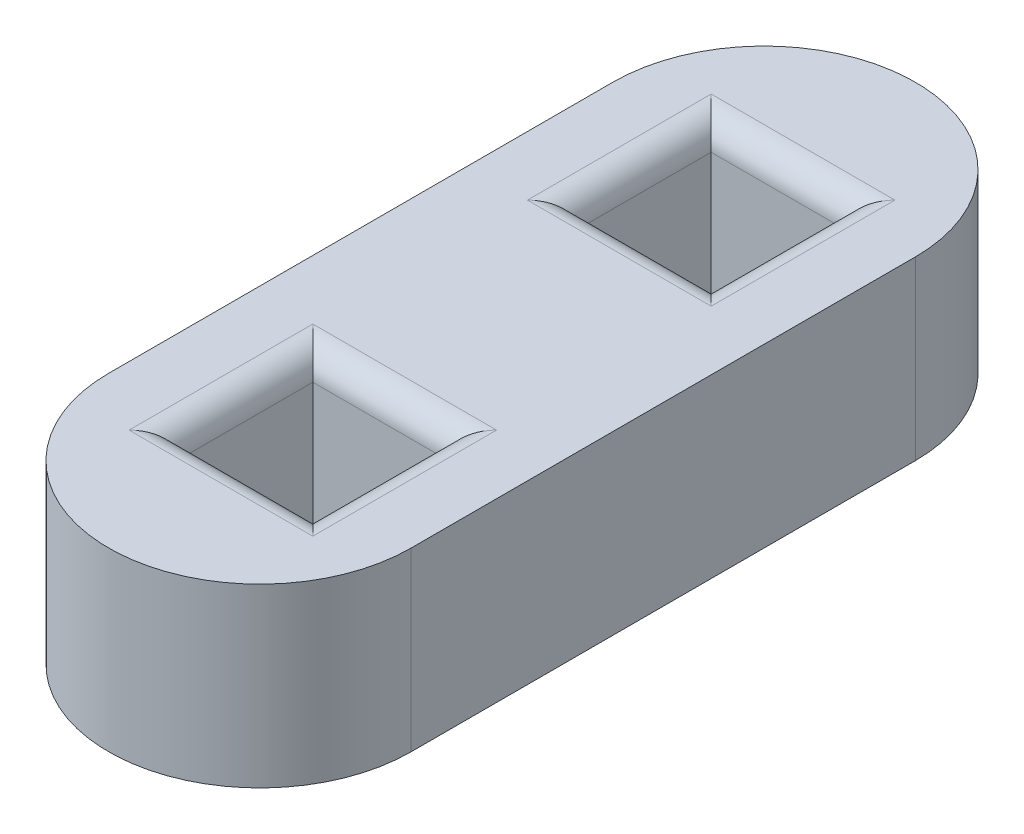
ISO-10303-21;
HEADER;
FILE_DESCRIPTION(('STEP AP214'),'2;1');
FILE_NAME('part.step','',(''),(''),'','','');
FILE_SCHEMA(('AUTOMOTIVE_DESIGN { 1 0 10303 214 1 1 1 1 }'));
ENDSEC;
DATA;
#1=APPLICATION_CONTEXT('core data for automotive mechanical design processes');
#2=APPLICATION_PROTOCOL_DEFINITION('international standard','automotive_design',2000,#1);
#3=PRODUCT_CONTEXT('',#1,'mechanical');
#4=PRODUCT('Part','Part','',(#3));
#5=PRODUCT_RELATED_PRODUCT_CATEGORY('part','',(#4));
#6=PRODUCT_DEFINITION_FORMATION('','',#4);
#7=PRODUCT_DEFINITION_CONTEXT('part definition',#1,'design');
#8=PRODUCT_DEFINITION('design','',#6,#7);
#9=PRODUCT_DEFINITION_SHAPE('','',#8);
#10=(LENGTH_UNIT() NAMED_UNIT(*) SI_UNIT(.MILLI.,.METRE.));
#11=(NAMED_UNIT(*) PLANE_ANGLE_UNIT() SI_UNIT($,.RADIAN.));
#12=(NAMED_UNIT(*) SI_UNIT($,.STERADIAN.) SOLID_ANGLE_UNIT());
#13=UNCERTAINTY_MEASURE_WITH_UNIT(LENGTH_MEASURE(1.E-05),#10,'distance_accuracy_value','');
#14=(GEOMETRIC_REPRESENTATION_CONTEXT(3) GLOBAL_UNCERTAINTY_ASSIGNED_CONTEXT((#13)) GLOBAL_UNIT_ASSIGNED_CONTEXT((#10,
#11,#12)) REPRESENTATION_CONTEXT('',''));
#15=CARTESIAN_POINT('',(0.,0.,0.));
#16=DIRECTION('',(0.,0.,1.));
#17=DIRECTION('',(1.,0.,0.));
#18=AXIS2_PLACEMENT_3D('',#15,#16,#17);
#19=CARTESIAN_POINT('',(0.,7.,0.));
#20=DIRECTION('',(0.,1.,0.));
#21=DIRECTION('',(0.,0.,1.));
#22=AXIS2_PLACEMENT_3D('',#19,#20,#21);
#23=PLANE('',#22);
#24=DIRECTION('',(1.,0.,0.));
#25=VECTOR('',#24,1.);
#26=CARTESIAN_POINT('',(0.,7.,21.544));
#27=LINE('',#26,#25);
#28=CARTESIAN_POINT('',(3.644,7.,21.544));
#29=VERTEX_POINT('',#28);
#30=CARTESIAN_POINT('',(-3.644,7.,21.544));
#31=VERTEX_POINT('',#30);
#32=EDGE_CURVE('E225',#29,#31,#27,.F.);
#33=ORIENTED_EDGE('',*,*,#32,.T.);
#34=DIRECTION('',(0.,0.,1.));
#35=VECTOR('',#34,1.);
#36=CARTESIAN_POINT('',(-3.644,7.,0.));
#37=LINE('',#36,#35);
#38=CARTESIAN_POINT('',(-3.644,7.,14.256));
#39=VERTEX_POINT('',#38);
#40=EDGE_CURVE('E227',#31,#39,#37,.F.);
#41=ORIENTED_EDGE('',*,*,#40,.T.);
#42=DIRECTION('',(-1.,0.,0.));
#43=VECTOR('',#42,1.);
#44=CARTESIAN_POINT('',(0.,7.,14.256));
#45=LINE('',#44,#43);
#46=CARTESIAN_POINT('',(3.644,7.,14.256));
#47=VERTEX_POINT('',#46);
#48=EDGE_CURVE('E221',#39,#47,#45,.F.);
#49=ORIENTED_EDGE('',*,*,#48,.T.);
#50=DIRECTION('',(0.,0.,-1.));
#51=VECTOR('',#50,1.);
#52=CARTESIAN_POINT('',(3.644,7.,0.));
#53=LINE('',#52,#51);
#54=EDGE_CURVE('E223',#47,#29,#53,.F.);
#55=ORIENTED_EDGE('',*,*,#54,.T.);
#56=EDGE_LOOP('',(#33,#41,#49,#55));
#57=FACE_BOUND('',#56,.T.);
#58=DIRECTION('',(0.,0.,-1.));
#59=VECTOR('',#58,1.);
#60=CARTESIAN_POINT('',(3.644,7.,0.));
#61=LINE('',#60,#59);
#62=CARTESIAN_POINT('',(3.644,7.,-1.544));
#63=VERTEX_POINT('',#62);
#64=CARTESIAN_POINT('',(3.644,7.,5.744));
#65=VERTEX_POINT('',#64);
#66=EDGE_CURVE('E216',#63,#65,#61,.F.);
#67=ORIENTED_EDGE('',*,*,#66,.T.);
#68=DIRECTION('',(1.,0.,0.));
#69=VECTOR('',#68,1.);
#70=CARTESIAN_POINT('',(0.,7.,5.744));
#71=LINE('',#70,#69);
#72=CARTESIAN_POINT('',(-3.644,7.,5.744));
#73=VERTEX_POINT('',#72);
#74=EDGE_CURVE('E218',#65,#73,#71,.F.);
#75=ORIENTED_EDGE('',*,*,#74,.T.);
#76=DIRECTION('',(0.,0.,1.));
#77=VECTOR('',#76,1.);
#78=CARTESIAN_POINT('',(-3.644,7.,0.));
#79=LINE('',#78,#77);
#80=CARTESIAN_POINT('',(-3.644,7.,-1.544));
#81=VERTEX_POINT('',#80);
#82=EDGE_CURVE('E214',#73,#81,#79,.F.);
#83=ORIENTED_EDGE('',*,*,#82,.T.);
#84=DIRECTION('',(-1.,0.,0.));
#85=VECTOR('',#84,1.);
#86=CARTESIAN_POINT('',(0.,7.,-1.544));
#87=LINE('',#86,#85);
#88=EDGE_CURVE('E212',#81,#63,#87,.F.);
#89=ORIENTED_EDGE('',*,*,#88,.T.);
#90=EDGE_LOOP('',(#67,#75,#83,#89));
#91=FACE_BOUND('',#90,.T.);
#92=CARTESIAN_POINT('',(0.,7.,0.));
#93=DIRECTION('',(0.,1.,0.));
#94=DIRECTION('',(0.,0.,1.));
#95=AXIS2_PLACEMENT_3D('',#92,#93,#94);
#96=CIRCLE('',#95,6.);
#97=CARTESIAN_POINT('',(6.,7.,0.));
#98=VERTEX_POINT('',#97);
#99=CARTESIAN_POINT('',(-6.,7.,0.));
#100=VERTEX_POINT('',#99);
#101=EDGE_CURVE('E189',#98,#100,#96,.T.);
#102=ORIENTED_EDGE('',*,*,#101,.T.);
#103=DIRECTION('',(0.,0.,1.));
#104=VECTOR('',#103,1.);
#105=CARTESIAN_POINT('',(-6.,7.,0.));
#106=LINE('',#105,#104);
#107=CARTESIAN_POINT('',(-6.,7.,20.));
#108=VERTEX_POINT('',#107);
#109=EDGE_CURVE('E178',#100,#108,#106,.T.);
#110=ORIENTED_EDGE('',*,*,#109,.T.);
#111=CARTESIAN_POINT('',(0.,7.,20.));
#112=DIRECTION('',(0.,1.,0.));
#113=DIRECTION('',(0.,0.,1.));
#114=AXIS2_PLACEMENT_3D('',#111,#112,#113);
#115=CIRCLE('',#114,6.);
#116=CARTESIAN_POINT('',(6.,7.,20.));
#117=VERTEX_POINT('',#116);
#118=EDGE_CURVE('E188',#108,#117,#115,.T.);
#119=ORIENTED_EDGE('',*,*,#118,.T.);
#120=DIRECTION('',(0.,0.,-1.));
#121=VECTOR('',#120,1.);
#122=CARTESIAN_POINT('',(6.,7.,0.));
#123=LINE('',#122,#121);
#124=EDGE_CURVE('E193',#117,#98,#123,.T.);
#125=ORIENTED_EDGE('',*,*,#124,.T.);
#126=EDGE_LOOP('',(#102,#110,#119,#125));
#127=FACE_BOUND('',#126,.T.);
#128=ADVANCED_FACE('F39',(#57,#91,#127),#23,.T.);
#129=CARTESIAN_POINT('',(0.,0.,0.));
#130=DIRECTION('',(0.,1.,0.));
#131=DIRECTION('',(0.,0.,1.));
#132=AXIS2_PLACEMENT_3D('',#129,#130,#131);
#133=PLANE('',#132);
#134=DIRECTION('',(1.,0.,0.));
#135=VECTOR('',#134,1.);
#136=CARTESIAN_POINT('',(2.644,0.,21.544));
#137=LINE('',#136,#135);
#138=CARTESIAN_POINT('',(-3.644,0.,21.544));
#139=VERTEX_POINT('',#138);
#140=CARTESIAN_POINT('',(3.644,0.,21.544));
#141=VERTEX_POINT('',#140);
#142=EDGE_CURVE('E256',#139,#141,#137,.T.);
#143=ORIENTED_EDGE('',*,*,#142,.T.);
#144=DIRECTION('',(0.,0.,-1.));
#145=VECTOR('',#144,1.);
#146=CARTESIAN_POINT('',(3.644,0.,15.256));
#147=LINE('',#146,#145);
#148=CARTESIAN_POINT('',(3.644,0.,14.256));
#149=VERTEX_POINT('',#148);
#150=EDGE_CURVE('E258',#141,#149,#147,.T.);
#151=ORIENTED_EDGE('',*,*,#150,.T.);
#152=DIRECTION('',(-1.,0.,0.));
#153=VECTOR('',#152,1.);
#154=CARTESIAN_POINT('',(-2.644,0.,14.256));
#155=LINE('',#154,#153);
#156=CARTESIAN_POINT('',(-3.644,0.,14.256));
#157=VERTEX_POINT('',#156);
#158=EDGE_CURVE('E252',#149,#157,#155,.T.);
#159=ORIENTED_EDGE('',*,*,#158,.T.);
#160=DIRECTION('',(0.,0.,1.));
#161=VECTOR('',#160,1.);
#162=CARTESIAN_POINT('',(-3.644,0.,20.544));
#163=LINE('',#162,#161);
#164=EDGE_CURVE('E254',#157,#139,#163,.T.);
#165=ORIENTED_EDGE('',*,*,#164,.T.);
#166=EDGE_LOOP('',(#143,#151,#159,#165));
#167=FACE_BOUND('',#166,.T.);
#168=DIRECTION('',(0.,0.,1.));
#169=VECTOR('',#168,1.);
#170=CARTESIAN_POINT('',(-3.644,0.,4.744));
#171=LINE('',#170,#169);
#172=CARTESIAN_POINT('',(-3.644,0.,-1.544));
#173=VERTEX_POINT('',#172);
#174=CARTESIAN_POINT('',(-3.644,0.,5.744));
#175=VERTEX_POINT('',#174);
#176=EDGE_CURVE('E243',#173,#175,#171,.T.);
#177=ORIENTED_EDGE('',*,*,#176,.T.);
#178=DIRECTION('',(1.,0.,0.));
#179=VECTOR('',#178,1.);
#180=CARTESIAN_POINT('',(2.644,0.,5.744));
#181=LINE('',#180,#179);
#182=CARTESIAN_POINT('',(3.644,0.,5.744));
#183=VERTEX_POINT('',#182);
#184=EDGE_CURVE('E249',#175,#183,#181,.T.);
#185=ORIENTED_EDGE('',*,*,#184,.T.);
#186=DIRECTION('',(0.,0.,-1.));
#187=VECTOR('',#186,1.);
#188=CARTESIAN_POINT('',(3.644,0.,-0.544000000000001));
#189=LINE('',#188,#187);
#190=CARTESIAN_POINT('',(3.644,0.,-1.544));
#191=VERTEX_POINT('',#190);
#192=EDGE_CURVE('E247',#183,#191,#189,.T.);
#193=ORIENTED_EDGE('',*,*,#192,.T.);
#194=DIRECTION('',(-1.,0.,0.));
#195=VECTOR('',#194,1.);
#196=CARTESIAN_POINT('',(-2.644,0.,-1.544));
#197=LINE('',#196,#195);
#198=EDGE_CURVE('E245',#191,#173,#197,.T.);
#199=ORIENTED_EDGE('',*,*,#198,.T.);
#200=EDGE_LOOP('',(#177,#185,#193,#199));
#201=FACE_BOUND('',#200,.T.);
#202=CARTESIAN_POINT('',(0.,0.,0.));
#203=DIRECTION('',(0.,1.,0.));
#204=DIRECTION('',(0.,0.,1.));
#205=AXIS2_PLACEMENT_3D('',#202,#203,#204);
#206=CIRCLE('',#205,6.);
#207=CARTESIAN_POINT('',(6.,0.,0.));
#208=VERTEX_POINT('',#207);
#209=CARTESIAN_POINT('',(-6.,0.,0.));
#210=VERTEX_POINT('',#209);
#211=EDGE_CURVE('E201',#208,#210,#206,.T.);
#212=ORIENTED_EDGE('',*,*,#211,.F.);
#213=DIRECTION('',(0.,0.,-1.));
#214=VECTOR('',#213,1.);
#215=CARTESIAN_POINT('',(6.,0.,0.));
#216=LINE('',#215,#214);
#217=CARTESIAN_POINT('',(6.,0.,20.));
#218=VERTEX_POINT('',#217);
#219=EDGE_CURVE('E197',#218,#208,#216,.T.);
#220=ORIENTED_EDGE('',*,*,#219,.F.);
#221=CARTESIAN_POINT('',(0.,0.,20.));
#222=DIRECTION('',(0.,1.,0.));
#223=DIRECTION('',(0.,0.,1.));
#224=AXIS2_PLACEMENT_3D('',#221,#222,#223);
#225=CIRCLE('',#224,6.);
#226=CARTESIAN_POINT('',(-6.,0.,20.));
#227=VERTEX_POINT('',#226);
#228=EDGE_CURVE('E361',#227,#218,#225,.T.);
#229=ORIENTED_EDGE('',*,*,#228,.F.);
#230=DIRECTION('',(0.,0.,1.));
#231=VECTOR('',#230,1.);
#232=CARTESIAN_POINT('',(-6.,0.,0.));
#233=LINE('',#232,#231);
#234=EDGE_CURVE('E359',#210,#227,#233,.T.);
#235=ORIENTED_EDGE('',*,*,#234,.F.);
#236=EDGE_LOOP('',(#212,#220,#229,#235));
#237=FACE_BOUND('',#236,.T.);
#238=ADVANCED_FACE('F372',(#167,#201,#237),#133,.F.);
#239=CARTESIAN_POINT('',(0.,7.,0.));
#240=DIRECTION('',(0.,-1.,0.));
#241=DIRECTION('',(0.,0.,-1.));
#242=AXIS2_PLACEMENT_3D('',#239,#240,#241);
#243=CYLINDRICAL_SURFACE('',#242,6.);
#244=ORIENTED_EDGE('',*,*,#211,.T.);
#245=DIRECTION('',(0.,-1.,0.));
#246=VECTOR('',#245,1.);
#247=CARTESIAN_POINT('',(-6.,7.,0.));
#248=LINE('',#247,#246);
#249=EDGE_CURVE('E182',#100,#210,#248,.T.);
#250=ORIENTED_EDGE('',*,*,#249,.F.);
#251=ORIENTED_EDGE('',*,*,#101,.F.);
#252=DIRECTION('',(0.,-1.,0.));
#253=VECTOR('',#252,1.);
#254=CARTESIAN_POINT('',(6.,7.,0.));
#255=LINE('',#254,#253);
#256=EDGE_CURVE('E357',#98,#208,#255,.T.);
#257=ORIENTED_EDGE('',*,*,#256,.T.);
#258=EDGE_LOOP('',(#244,#250,#251,#257));
#259=FACE_BOUND('',#258,.T.);
#260=ADVANCED_FACE('F199',(#259),#243,.T.);
#261=CARTESIAN_POINT('',(-6.,7.,0.));
#262=DIRECTION('',(1.,0.,0.));
#263=DIRECTION('',(0.,0.,-1.));
#264=AXIS2_PLACEMENT_3D('',#261,#262,#263);
#265=PLANE('',#264);
#266=ORIENTED_EDGE('',*,*,#234,.T.);
#267=DIRECTION('',(0.,-1.,0.));
#268=VECTOR('',#267,1.);
#269=CARTESIAN_POINT('',(-6.,7.,20.));
#270=LINE('',#269,#268);
#271=EDGE_CURVE('E185',#108,#227,#270,.T.);
#272=ORIENTED_EDGE('',*,*,#271,.F.);
#273=ORIENTED_EDGE('',*,*,#109,.F.);
#274=ORIENTED_EDGE('',*,*,#249,.T.);
#275=EDGE_LOOP('',(#266,#272,#273,#274));
#276=FACE_BOUND('',#275,.T.);
#277=ADVANCED_FACE('F180',(#276),#265,.F.);
#278=CARTESIAN_POINT('',(0.,7.,20.));
#279=DIRECTION('',(0.,-1.,0.));
#280=DIRECTION('',(0.,0.,-1.));
#281=AXIS2_PLACEMENT_3D('',#278,#279,#280);
#282=CYLINDRICAL_SURFACE('',#281,6.);
#283=ORIENTED_EDGE('',*,*,#228,.T.);
#284=DIRECTION('',(0.,-1.,0.));
#285=VECTOR('',#284,1.);
#286=CARTESIAN_POINT('',(6.,7.,20.));
#287=LINE('',#286,#285);
#288=EDGE_CURVE('E206',#117,#218,#287,.T.);
#289=ORIENTED_EDGE('',*,*,#288,.F.);
#290=ORIENTED_EDGE('',*,*,#118,.F.);
#291=ORIENTED_EDGE('',*,*,#271,.T.);
#292=EDGE_LOOP('',(#283,#289,#290,#291));
#293=FACE_BOUND('',#292,.T.);
#294=ADVANCED_FACE('F373',(#293),#282,.T.);
#295=CARTESIAN_POINT('',(6.,7.,0.));
#296=DIRECTION('',(-1.,0.,0.));
#297=DIRECTION('',(0.,0.,1.));
#298=AXIS2_PLACEMENT_3D('',#295,#296,#297);
#299=PLANE('',#298);
#300=ORIENTED_EDGE('',*,*,#219,.T.);
#301=ORIENTED_EDGE('',*,*,#256,.F.);
#302=ORIENTED_EDGE('',*,*,#124,.F.);
#303=ORIENTED_EDGE('',*,*,#288,.T.);
#304=EDGE_LOOP('',(#300,#301,#302,#303));
#305=FACE_BOUND('',#304,.T.);
#306=ADVANCED_FACE('F368',(#305),#299,.F.);
#307=CARTESIAN_POINT('',(2.644,7.,4.744));
#308=DIRECTION('',(-1.,0.,0.));
#309=DIRECTION('',(0.,0.,1.));
#310=AXIS2_PLACEMENT_3D('',#307,#308,#309);
#311=PLANE('',#310);
#312=DIRECTION('',(0.,-1.,0.));
#313=VECTOR('',#312,1.);
#314=CARTESIAN_POINT('',(2.644,7.,-0.544000000000001));
#315=LINE('',#314,#313);
#316=CARTESIAN_POINT('',(2.644,6.,-0.544000000000001));
#317=VERTEX_POINT('',#316);
#318=CARTESIAN_POINT('',(2.644,1.,-0.544000000000001));
#319=VERTEX_POINT('',#318);
#320=EDGE_CURVE('E353',#317,#319,#315,.T.);
#321=ORIENTED_EDGE('',*,*,#320,.T.);
#322=DIRECTION('',(0.,0.,-1.));
#323=VECTOR('',#322,1.);
#324=CARTESIAN_POINT('',(2.644,1.,4.744));
#325=LINE('',#324,#323);
#326=CARTESIAN_POINT('',(2.644,1.,4.744));
#327=VERTEX_POINT('',#326);
#328=EDGE_CURVE('E269',#319,#327,#325,.F.);
#329=ORIENTED_EDGE('',*,*,#328,.T.);
#330=DIRECTION('',(0.,-1.,0.));
#331=VECTOR('',#330,1.);
#332=CARTESIAN_POINT('',(2.644,7.,4.744));
#333=LINE('',#332,#331);
#334=CARTESIAN_POINT('',(2.644,6.,4.744));
#335=VERTEX_POINT('',#334);
#336=EDGE_CURVE('E338',#335,#327,#333,.T.);
#337=ORIENTED_EDGE('',*,*,#336,.F.);
#338=DIRECTION('',(0.,0.,-1.));
#339=VECTOR('',#338,1.);
#340=CARTESIAN_POINT('',(2.644,6.,4.744));
#341=LINE('',#340,#339);
#342=EDGE_CURVE('E267',#335,#317,#341,.T.);
#343=ORIENTED_EDGE('',*,*,#342,.T.);
#344=EDGE_LOOP('',(#321,#329,#337,#343));
#345=FACE_BOUND('',#344,.T.);
#346=ADVANCED_FACE('F341',(#345),#311,.T.);
#347=CARTESIAN_POINT('',(-2.644,7.,-0.544000000000001));
#348=DIRECTION('',(0.,0.,1.));
#349=DIRECTION('',(1.,0.,0.));
#350=AXIS2_PLACEMENT_3D('',#347,#348,#349);
#351=PLANE('',#350);
#352=DIRECTION('',(0.,-1.,0.));
#353=VECTOR('',#352,1.);
#354=CARTESIAN_POINT('',(-2.644,7.,-0.544000000000001));
#355=LINE('',#354,#353);
#356=CARTESIAN_POINT('',(-2.644,6.,-0.544000000000001));
#357=VERTEX_POINT('',#356);
#358=CARTESIAN_POINT('',(-2.644,1.,-0.544000000000001));
#359=VERTEX_POINT('',#358);
#360=EDGE_CURVE('E345',#357,#359,#355,.T.);
#361=ORIENTED_EDGE('',*,*,#360,.T.);
#362=DIRECTION('',(-1.,0.,0.));
#363=VECTOR('',#362,1.);
#364=CARTESIAN_POINT('',(2.644,1.,-0.544000000000001));
#365=LINE('',#364,#363);
#366=EDGE_CURVE('E272',#359,#319,#365,.F.);
#367=ORIENTED_EDGE('',*,*,#366,.T.);
#368=ORIENTED_EDGE('',*,*,#320,.F.);
#369=DIRECTION('',(-1.,0.,0.));
#370=VECTOR('',#369,1.);
#371=CARTESIAN_POINT('',(-2.644,6.,-0.544000000000001));
#372=LINE('',#371,#370);
#373=EDGE_CURVE('E61',#317,#357,#372,.T.);
#374=ORIENTED_EDGE('',*,*,#373,.T.);
#375=EDGE_LOOP('',(#361,#367,#368,#374));
#376=FACE_BOUND('',#375,.T.);
#377=ADVANCED_FACE('F393',(#376),#351,.T.);
#378=CARTESIAN_POINT('',(-2.644,7.,4.744));
#379=DIRECTION('',(1.,0.,0.));
#380=DIRECTION('',(0.,0.,-1.));
#381=AXIS2_PLACEMENT_3D('',#378,#379,#380);
#382=PLANE('',#381);
#383=DIRECTION('',(0.,-1.,0.));
#384=VECTOR('',#383,1.);
#385=CARTESIAN_POINT('',(-2.644,7.,4.744));
#386=LINE('',#385,#384);
#387=CARTESIAN_POINT('',(-2.644,6.,4.744));
#388=VERTEX_POINT('',#387);
#389=CARTESIAN_POINT('',(-2.644,1.,4.744));
#390=VERTEX_POINT('',#389);
#391=EDGE_CURVE('E340',#388,#390,#386,.T.);
#392=ORIENTED_EDGE('',*,*,#391,.T.);
#393=DIRECTION('',(0.,0.,1.));
#394=VECTOR('',#393,1.);
#395=CARTESIAN_POINT('',(-2.644,1.,-0.544000000000001));
#396=LINE('',#395,#394);
#397=EDGE_CURVE('E11',#390,#359,#396,.F.);
#398=ORIENTED_EDGE('',*,*,#397,.T.);
#399=ORIENTED_EDGE('',*,*,#360,.F.);
#400=DIRECTION('',(0.,0.,1.));
#401=VECTOR('',#400,1.);
#402=CARTESIAN_POINT('',(-2.644,6.,4.744));
#403=LINE('',#402,#401);
#404=EDGE_CURVE('E48',#357,#388,#403,.T.);
#405=ORIENTED_EDGE('',*,*,#404,.T.);
#406=EDGE_LOOP('',(#392,#398,#399,#405));
#407=FACE_BOUND('',#406,.T.);
#408=ADVANCED_FACE('F396',(#407),#382,.T.);
#409=CARTESIAN_POINT('',(-2.644,7.,4.744));
#410=DIRECTION('',(0.,0.,-1.));
#411=DIRECTION('',(-1.,0.,0.));
#412=AXIS2_PLACEMENT_3D('',#409,#410,#411);
#413=PLANE('',#412);
#414=ORIENTED_EDGE('',*,*,#336,.T.);
#415=DIRECTION('',(1.,0.,0.));
#416=VECTOR('',#415,1.);
#417=CARTESIAN_POINT('',(-2.644,1.,4.744));
#418=LINE('',#417,#416);
#419=EDGE_CURVE('E264',#327,#390,#418,.F.);
#420=ORIENTED_EDGE('',*,*,#419,.T.);
#421=ORIENTED_EDGE('',*,*,#391,.F.);
#422=DIRECTION('',(1.,0.,0.));
#423=VECTOR('',#422,1.);
#424=CARTESIAN_POINT('',(-2.644,6.,4.744));
#425=LINE('',#424,#423);
#426=EDGE_CURVE('E261',#388,#335,#425,.T.);
#427=ORIENTED_EDGE('',*,*,#426,.T.);
#428=EDGE_LOOP('',(#414,#420,#421,#427));
#429=FACE_BOUND('',#428,.T.);
#430=ADVANCED_FACE('F337',(#429),#413,.T.);
#431=CARTESIAN_POINT('',(-2.644,7.,15.256));
#432=DIRECTION('',(1.,0.,0.));
#433=DIRECTION('',(0.,0.,-1.));
#434=AXIS2_PLACEMENT_3D('',#431,#432,#433);
#435=PLANE('',#434);
#436=DIRECTION('',(0.,-1.,0.));
#437=VECTOR('',#436,1.);
#438=CARTESIAN_POINT('',(-2.644,7.,15.256));
#439=LINE('',#438,#437);
#440=CARTESIAN_POINT('',(-2.644,6.,15.256));
#441=VERTEX_POINT('',#440);
#442=CARTESIAN_POINT('',(-2.644,1.,15.256));
#443=VERTEX_POINT('',#442);
#444=EDGE_CURVE('E286',#441,#443,#439,.T.);
#445=ORIENTED_EDGE('',*,*,#444,.F.);
#446=DIRECTION('',(0.,0.,1.));
#447=VECTOR('',#446,1.);
#448=CARTESIAN_POINT('',(-2.644,6.,15.256));
#449=LINE('',#448,#447);
#450=CARTESIAN_POINT('',(-2.644,6.,20.544));
#451=VERTEX_POINT('',#450);
#452=EDGE_CURVE('E204',#441,#451,#449,.T.);
#453=ORIENTED_EDGE('',*,*,#452,.T.);
#454=DIRECTION('',(0.,-1.,0.));
#455=VECTOR('',#454,1.);
#456=CARTESIAN_POINT('',(-2.644,7.,20.544));
#457=LINE('',#456,#455);
#458=CARTESIAN_POINT('',(-2.644,1.,20.544));
#459=VERTEX_POINT('',#458);
#460=EDGE_CURVE('E343',#451,#459,#457,.T.);
#461=ORIENTED_EDGE('',*,*,#460,.T.);
#462=DIRECTION('',(0.,0.,1.));
#463=VECTOR('',#462,1.);
#464=CARTESIAN_POINT('',(-2.644,1.,15.256));
#465=LINE('',#464,#463);
#466=EDGE_CURVE('E202',#459,#443,#465,.F.);
#467=ORIENTED_EDGE('',*,*,#466,.T.);
#468=EDGE_LOOP('',(#445,#453,#461,#467));
#469=FACE_BOUND('',#468,.T.);
#470=ADVANCED_FACE('F401',(#469),#435,.T.);
#471=CARTESIAN_POINT('',(-2.644,7.,20.544));
#472=DIRECTION('',(0.,0.,-1.));
#473=DIRECTION('',(-1.,0.,0.));
#474=AXIS2_PLACEMENT_3D('',#471,#472,#473);
#475=PLANE('',#474);
#476=ORIENTED_EDGE('',*,*,#460,.F.);
#477=DIRECTION('',(1.,0.,0.));
#478=VECTOR('',#477,1.);
#479=CARTESIAN_POINT('',(-2.644,6.,20.544));
#480=LINE('',#479,#478);
#481=CARTESIAN_POINT('',(2.644,6.,20.544));
#482=VERTEX_POINT('',#481);
#483=EDGE_CURVE('E232',#451,#482,#480,.T.);
#484=ORIENTED_EDGE('',*,*,#483,.T.);
#485=DIRECTION('',(0.,-1.,0.));
#486=VECTOR('',#485,1.);
#487=CARTESIAN_POINT('',(2.644,7.,20.544));
#488=LINE('',#487,#486);
#489=CARTESIAN_POINT('',(2.644,1.,20.544));
#490=VERTEX_POINT('',#489);
#491=EDGE_CURVE('E348',#482,#490,#488,.T.);
#492=ORIENTED_EDGE('',*,*,#491,.T.);
#493=DIRECTION('',(1.,0.,0.));
#494=VECTOR('',#493,1.);
#495=CARTESIAN_POINT('',(-2.644,1.,20.544));
#496=LINE('',#495,#494);
#497=EDGE_CURVE('E230',#490,#459,#496,.F.);
#498=ORIENTED_EDGE('',*,*,#497,.T.);
#499=EDGE_LOOP('',(#476,#484,#492,#498));
#500=FACE_BOUND('',#499,.T.);
#501=ADVANCED_FACE('F404',(#500),#475,.T.);
#502=CARTESIAN_POINT('',(2.644,7.,15.256));
#503=DIRECTION('',(-1.,0.,0.));
#504=DIRECTION('',(0.,0.,1.));
#505=AXIS2_PLACEMENT_3D('',#502,#503,#504);
#506=PLANE('',#505);
#507=ORIENTED_EDGE('',*,*,#491,.F.);
#508=DIRECTION('',(0.,0.,-1.));
#509=VECTOR('',#508,1.);
#510=CARTESIAN_POINT('',(2.644,6.,15.256));
#511=LINE('',#510,#509);
#512=CARTESIAN_POINT('',(2.644,6.,15.256));
#513=VERTEX_POINT('',#512);
#514=EDGE_CURVE('E237',#482,#513,#511,.T.);
#515=ORIENTED_EDGE('',*,*,#514,.T.);
#516=DIRECTION('',(0.,-1.,0.));
#517=VECTOR('',#516,1.);
#518=CARTESIAN_POINT('',(2.644,7.,15.256));
#519=LINE('',#518,#517);
#520=CARTESIAN_POINT('',(2.644,1.,15.256));
#521=VERTEX_POINT('',#520);
#522=EDGE_CURVE('E425',#513,#521,#519,.T.);
#523=ORIENTED_EDGE('',*,*,#522,.T.);
#524=DIRECTION('',(0.,0.,-1.));
#525=VECTOR('',#524,1.);
#526=CARTESIAN_POINT('',(2.644,1.,20.544));
#527=LINE('',#526,#525);
#528=EDGE_CURVE('E234',#521,#490,#527,.F.);
#529=ORIENTED_EDGE('',*,*,#528,.T.);
#530=EDGE_LOOP('',(#507,#515,#523,#529));
#531=FACE_BOUND('',#530,.T.);
#532=ADVANCED_FACE('F408',(#531),#506,.T.);
#533=CARTESIAN_POINT('',(-2.644,7.,15.256));
#534=DIRECTION('',(0.,0.,1.));
#535=DIRECTION('',(1.,0.,0.));
#536=AXIS2_PLACEMENT_3D('',#533,#534,#535);
#537=PLANE('',#536);
#538=ORIENTED_EDGE('',*,*,#522,.F.);
#539=DIRECTION('',(-1.,0.,0.));
#540=VECTOR('',#539,1.);
#541=CARTESIAN_POINT('',(-2.644,6.,15.256));
#542=LINE('',#541,#540);
#543=EDGE_CURVE('E241',#513,#441,#542,.T.);
#544=ORIENTED_EDGE('',*,*,#543,.T.);
#545=ORIENTED_EDGE('',*,*,#444,.T.);
#546=DIRECTION('',(-1.,0.,0.));
#547=VECTOR('',#546,1.);
#548=CARTESIAN_POINT('',(2.644,1.,15.256));
#549=LINE('',#548,#547);
#550=EDGE_CURVE('E239',#443,#521,#549,.F.);
#551=ORIENTED_EDGE('',*,*,#550,.T.);
#552=EDGE_LOOP('',(#538,#544,#545,#551));
#553=FACE_BOUND('',#552,.T.);
#554=ADVANCED_FACE('F412',(#553),#537,.T.);
#555=CARTESIAN_POINT('',(3.644,6.,15.256));
#556=DIRECTION('',(0.,0.,-1.));
#557=DIRECTION('',(-1.,0.,0.));
#558=AXIS2_PLACEMENT_3D('',#555,#556,#557);
#559=CYLINDRICAL_SURFACE('',#558,1.);
#560=CARTESIAN_POINT('',(3.644,6.,21.544));
#561=DIRECTION('',(0.707106781186547,0.,-0.707106781186548));
#562=DIRECTION('',(0.707106781186548,0.,0.707106781186547));
#563=AXIS2_PLACEMENT_3D('',#560,#561,#562);
#564=ELLIPSE('',#563,1.41421356237309,1.);
#565=EDGE_CURVE('E280',#29,#482,#564,.F.);
#566=ORIENTED_EDGE('',*,*,#565,.F.);
#567=ORIENTED_EDGE('',*,*,#54,.F.);
#568=CARTESIAN_POINT('',(3.644,6.,14.256));
#569=DIRECTION('',(-0.707106781186548,0.,-0.707106781186547));
#570=DIRECTION('',(0.707106781186547,0.,-0.707106781186548));
#571=AXIS2_PLACEMENT_3D('',#568,#569,#570);
#572=ELLIPSE('',#571,1.41421356237309,1.);
#573=EDGE_CURVE('E283',#513,#47,#572,.T.);
#574=ORIENTED_EDGE('',*,*,#573,.F.);
#575=ORIENTED_EDGE('',*,*,#514,.F.);
#576=EDGE_LOOP('',(#566,#567,#574,#575));
#577=FACE_BOUND('',#576,.T.);
#578=ADVANCED_FACE('F415',(#577),#559,.T.);
#579=CARTESIAN_POINT('',(-2.644,6.,14.256));
#580=DIRECTION('',(-1.,0.,0.));
#581=DIRECTION('',(0.,0.,1.));
#582=AXIS2_PLACEMENT_3D('',#579,#580,#581);
#583=CYLINDRICAL_SURFACE('',#582,1.);
#584=ORIENTED_EDGE('',*,*,#573,.T.);
#585=ORIENTED_EDGE('',*,*,#48,.F.);
#586=CARTESIAN_POINT('',(-3.644,6.,14.256));
#587=DIRECTION('',(-0.707106781186547,0.,0.707106781186548));
#588=DIRECTION('',(0.707106781186548,0.,0.707106781186547));
#589=AXIS2_PLACEMENT_3D('',#586,#587,#588);
#590=ELLIPSE('',#589,1.4142135623731,1.);
#591=EDGE_CURVE('E277',#441,#39,#590,.T.);
#592=ORIENTED_EDGE('',*,*,#591,.F.);
#593=ORIENTED_EDGE('',*,*,#543,.F.);
#594=EDGE_LOOP('',(#584,#585,#592,#593));
#595=FACE_BOUND('',#594,.T.);
#596=ADVANCED_FACE('F420',(#595),#583,.T.);
#597=CARTESIAN_POINT('',(-2.644,6.,21.544));
#598=DIRECTION('',(1.,0.,0.));
#599=DIRECTION('',(0.,0.,-1.));
#600=AXIS2_PLACEMENT_3D('',#597,#598,#599);
#601=CYLINDRICAL_SURFACE('',#600,1.);
#602=ORIENTED_EDGE('',*,*,#565,.T.);
#603=ORIENTED_EDGE('',*,*,#483,.F.);
#604=CARTESIAN_POINT('',(-3.644,6.,21.544));
#605=DIRECTION('',(0.707106781186548,0.,0.707106781186547));
#606=DIRECTION('',(-0.707106781186547,0.,0.707106781186548));
#607=AXIS2_PLACEMENT_3D('',#604,#605,#606);
#608=ELLIPSE('',#607,1.4142135623731,1.);
#609=EDGE_CURVE('E275',#31,#451,#608,.F.);
#610=ORIENTED_EDGE('',*,*,#609,.F.);
#611=ORIENTED_EDGE('',*,*,#32,.F.);
#612=EDGE_LOOP('',(#602,#603,#610,#611));
#613=FACE_BOUND('',#612,.T.);
#614=ADVANCED_FACE('F475',(#613),#601,.T.);
#615=CARTESIAN_POINT('',(-3.644,6.,15.256));
#616=DIRECTION('',(0.,0.,1.));
#617=DIRECTION('',(1.,0.,0.));
#618=AXIS2_PLACEMENT_3D('',#615,#616,#617);
#619=CYLINDRICAL_SURFACE('',#618,1.);
#620=ORIENTED_EDGE('',*,*,#591,.T.);
#621=ORIENTED_EDGE('',*,*,#40,.F.);
#622=ORIENTED_EDGE('',*,*,#609,.T.);
#623=ORIENTED_EDGE('',*,*,#452,.F.);
#624=EDGE_LOOP('',(#620,#621,#622,#623));
#625=FACE_BOUND('',#624,.T.);
#626=ADVANCED_FACE('F442',(#625),#619,.T.);
#627=CARTESIAN_POINT('',(-3.644,1.,0.));
#628=DIRECTION('',(0.,0.,-1.));
#629=DIRECTION('',(-1.,0.,0.));
#630=AXIS2_PLACEMENT_3D('',#627,#628,#629);
#631=CYLINDRICAL_SURFACE('',#630,1.);
#632=CARTESIAN_POINT('',(-3.644,1.,14.256));
#633=DIRECTION('',(0.707106781186547,0.,-0.707106781186548));
#634=DIRECTION('',(-0.707106781186548,0.,-0.707106781186547));
#635=AXIS2_PLACEMENT_3D('',#632,#633,#634);
#636=ELLIPSE('',#635,1.4142135623731,1.);
#637=EDGE_CURVE('E292',#443,#157,#636,.T.);
#638=ORIENTED_EDGE('',*,*,#637,.F.);
#639=ORIENTED_EDGE('',*,*,#466,.F.);
#640=CARTESIAN_POINT('',(-3.644,1.,21.544));
#641=DIRECTION('',(-0.707106781186548,0.,-0.707106781186547));
#642=DIRECTION('',(-0.707106781186547,0.,0.707106781186548));
#643=AXIS2_PLACEMENT_3D('',#640,#641,#642);
#644=ELLIPSE('',#643,1.4142135623731,1.);
#645=EDGE_CURVE('E278',#139,#459,#644,.F.);
#646=ORIENTED_EDGE('',*,*,#645,.F.);
#647=ORIENTED_EDGE('',*,*,#164,.F.);
#648=EDGE_LOOP('',(#638,#639,#646,#647));
#649=FACE_BOUND('',#648,.T.);
#650=ADVANCED_FACE('F466',(#649),#631,.T.);
#651=CARTESIAN_POINT('',(0.,1.,21.544));
#652=DIRECTION('',(-1.,0.,0.));
#653=DIRECTION('',(0.,0.,1.));
#654=AXIS2_PLACEMENT_3D('',#651,#652,#653);
#655=CYLINDRICAL_SURFACE('',#654,1.);
#656=ORIENTED_EDGE('',*,*,#645,.T.);
#657=ORIENTED_EDGE('',*,*,#497,.F.);
#658=CARTESIAN_POINT('',(3.644,1.,21.544));
#659=DIRECTION('',(-0.707106781186547,0.,0.707106781186548));
#660=DIRECTION('',(0.707106781186548,0.,0.707106781186547));
#661=AXIS2_PLACEMENT_3D('',#658,#659,#660);
#662=ELLIPSE('',#661,1.41421356237309,1.);
#663=EDGE_CURVE('E289',#141,#490,#662,.F.);
#664=ORIENTED_EDGE('',*,*,#663,.F.);
#665=ORIENTED_EDGE('',*,*,#142,.F.);
#666=EDGE_LOOP('',(#656,#657,#664,#665));
#667=FACE_BOUND('',#666,.T.);
#668=ADVANCED_FACE('F452',(#667),#655,.T.);
#669=CARTESIAN_POINT('',(0.,1.,14.256));
#670=DIRECTION('',(1.,0.,0.));
#671=DIRECTION('',(0.,0.,-1.));
#672=AXIS2_PLACEMENT_3D('',#669,#670,#671);
#673=CYLINDRICAL_SURFACE('',#672,1.);
#674=ORIENTED_EDGE('',*,*,#637,.T.);
#675=ORIENTED_EDGE('',*,*,#158,.F.);
#676=CARTESIAN_POINT('',(3.644,1.,14.256));
#677=DIRECTION('',(0.707106781186548,0.,0.707106781186547));
#678=DIRECTION('',(-0.707106781186547,0.,0.707106781186548));
#679=AXIS2_PLACEMENT_3D('',#676,#677,#678);
#680=ELLIPSE('',#679,1.41421356237309,1.);
#681=EDGE_CURVE('E287',#521,#149,#680,.T.);
#682=ORIENTED_EDGE('',*,*,#681,.F.);
#683=ORIENTED_EDGE('',*,*,#550,.F.);
#684=EDGE_LOOP('',(#674,#675,#682,#683));
#685=FACE_BOUND('',#684,.T.);
#686=ADVANCED_FACE('F461',(#685),#673,.T.);
#687=CARTESIAN_POINT('',(3.644,1.,0.));
#688=DIRECTION('',(0.,0.,1.));
#689=DIRECTION('',(1.,0.,0.));
#690=AXIS2_PLACEMENT_3D('',#687,#688,#689);
#691=CYLINDRICAL_SURFACE('',#690,1.);
#692=ORIENTED_EDGE('',*,*,#663,.T.);
#693=ORIENTED_EDGE('',*,*,#528,.F.);
#694=ORIENTED_EDGE('',*,*,#681,.T.);
#695=ORIENTED_EDGE('',*,*,#150,.F.);
#696=EDGE_LOOP('',(#692,#693,#694,#695));
#697=FACE_BOUND('',#696,.T.);
#698=ADVANCED_FACE('F458',(#697),#691,.T.);
#699=CARTESIAN_POINT('',(0.,1.,-1.544));
#700=DIRECTION('',(1.,0.,0.));
#701=DIRECTION('',(0.,0.,-1.));
#702=AXIS2_PLACEMENT_3D('',#699,#700,#701);
#703=CYLINDRICAL_SURFACE('',#702,1.);
#704=CARTESIAN_POINT('',(3.644,1.,-1.544));
#705=DIRECTION('',(0.707106781186547,0.,0.707106781186547));
#706=DIRECTION('',(-0.707106781186547,0.,0.707106781186547));
#707=AXIS2_PLACEMENT_3D('',#704,#705,#706);
#708=ELLIPSE('',#707,1.41421356237309,1.);
#709=EDGE_CURVE('E301',#319,#191,#708,.T.);
#710=ORIENTED_EDGE('',*,*,#709,.F.);
#711=ORIENTED_EDGE('',*,*,#366,.F.);
#712=CARTESIAN_POINT('',(-3.644,1.,-1.544));
#713=DIRECTION('',(0.707106781186547,0.,-0.707106781186547));
#714=DIRECTION('',(0.707106781186547,0.,0.707106781186547));
#715=AXIS2_PLACEMENT_3D('',#712,#713,#714);
#716=ELLIPSE('',#715,1.41421356237309,1.);
#717=EDGE_CURVE('E290',#173,#359,#716,.F.);
#718=ORIENTED_EDGE('',*,*,#717,.F.);
#719=ORIENTED_EDGE('',*,*,#198,.F.);
#720=EDGE_LOOP('',(#710,#711,#718,#719));
#721=FACE_BOUND('',#720,.T.);
#722=ADVANCED_FACE('F490',(#721),#703,.T.);
#723=CARTESIAN_POINT('',(-3.644,1.,0.));
#724=DIRECTION('',(0.,0.,-1.));
#725=DIRECTION('',(-1.,0.,0.));
#726=AXIS2_PLACEMENT_3D('',#723,#724,#725);
#727=CYLINDRICAL_SURFACE('',#726,1.);
#728=ORIENTED_EDGE('',*,*,#717,.T.);
#729=ORIENTED_EDGE('',*,*,#397,.F.);
#730=CARTESIAN_POINT('',(-3.644,1.,5.744));
#731=DIRECTION('',(-0.707106781186547,0.,-0.707106781186547));
#732=DIRECTION('',(-0.707106781186547,0.,0.707106781186547));
#733=AXIS2_PLACEMENT_3D('',#730,#731,#732);
#734=ELLIPSE('',#733,1.41421356237309,1.);
#735=EDGE_CURVE('E299',#175,#390,#734,.F.);
#736=ORIENTED_EDGE('',*,*,#735,.F.);
#737=ORIENTED_EDGE('',*,*,#176,.F.);
#738=EDGE_LOOP('',(#728,#729,#736,#737));
#739=FACE_BOUND('',#738,.T.);
#740=ADVANCED_FACE('F486',(#739),#727,.T.);
#741=CARTESIAN_POINT('',(3.644,1.,0.));
#742=DIRECTION('',(0.,0.,1.));
#743=DIRECTION('',(1.,0.,0.));
#744=AXIS2_PLACEMENT_3D('',#741,#742,#743);
#745=CYLINDRICAL_SURFACE('',#744,1.);
#746=ORIENTED_EDGE('',*,*,#709,.T.);
#747=ORIENTED_EDGE('',*,*,#192,.F.);
#748=CARTESIAN_POINT('',(3.644,1.,5.744));
#749=DIRECTION('',(-0.707106781186547,0.,0.707106781186547));
#750=DIRECTION('',(-0.707106781186547,0.,-0.707106781186547));
#751=AXIS2_PLACEMENT_3D('',#748,#749,#750);
#752=ELLIPSE('',#751,1.41421356237309,1.);
#753=EDGE_CURVE('E297',#327,#183,#752,.T.);
#754=ORIENTED_EDGE('',*,*,#753,.F.);
#755=ORIENTED_EDGE('',*,*,#328,.F.);
#756=EDGE_LOOP('',(#746,#747,#754,#755));
#757=FACE_BOUND('',#756,.T.);
#758=ADVANCED_FACE('F482',(#757),#745,.T.);
#759=CARTESIAN_POINT('',(0.,1.,5.744));
#760=DIRECTION('',(-1.,0.,0.));
#761=DIRECTION('',(0.,0.,1.));
#762=AXIS2_PLACEMENT_3D('',#759,#760,#761);
#763=CYLINDRICAL_SURFACE('',#762,1.);
#764=ORIENTED_EDGE('',*,*,#735,.T.);
#765=ORIENTED_EDGE('',*,*,#419,.F.);
#766=ORIENTED_EDGE('',*,*,#753,.T.);
#767=ORIENTED_EDGE('',*,*,#184,.F.);
#768=EDGE_LOOP('',(#764,#765,#766,#767));
#769=FACE_BOUND('',#768,.T.);
#770=ADVANCED_FACE('F479',(#769),#763,.T.);
#771=CARTESIAN_POINT('',(-2.644,6.,-1.544));
#772=DIRECTION('',(-1.,0.,0.));
#773=DIRECTION('',(0.,0.,1.));
#774=AXIS2_PLACEMENT_3D('',#771,#772,#773);
#775=CYLINDRICAL_SURFACE('',#774,1.);
#776=CARTESIAN_POINT('',(3.644,6.,-1.544));
#777=DIRECTION('',(-0.707106781186547,0.,-0.707106781186547));
#778=DIRECTION('',(0.707106781186547,0.,-0.707106781186547));
#779=AXIS2_PLACEMENT_3D('',#776,#777,#778);
#780=ELLIPSE('',#779,1.41421356237309,1.);
#781=EDGE_CURVE('E309',#63,#317,#780,.F.);
#782=ORIENTED_EDGE('',*,*,#781,.F.);
#783=ORIENTED_EDGE('',*,*,#88,.F.);
#784=CARTESIAN_POINT('',(-3.644,6.,-1.544));
#785=DIRECTION('',(-0.707106781186547,0.,0.707106781186547));
#786=DIRECTION('',(0.707106781186547,0.,0.707106781186547));
#787=AXIS2_PLACEMENT_3D('',#784,#785,#786);
#788=ELLIPSE('',#787,1.41421356237309,1.);
#789=EDGE_CURVE('E43',#357,#81,#788,.T.);
#790=ORIENTED_EDGE('',*,*,#789,.F.);
#791=ORIENTED_EDGE('',*,*,#373,.F.);
#792=EDGE_LOOP('',(#782,#783,#790,#791));
#793=FACE_BOUND('',#792,.T.);
#794=ADVANCED_FACE('F41',(#793),#775,.T.);
#795=CARTESIAN_POINT('',(-3.644,6.,4.744));
#796=DIRECTION('',(0.,0.,1.));
#797=DIRECTION('',(1.,0.,0.));
#798=AXIS2_PLACEMENT_3D('',#795,#796,#797);
#799=CYLINDRICAL_SURFACE('',#798,1.);
#800=ORIENTED_EDGE('',*,*,#789,.T.);
#801=ORIENTED_EDGE('',*,*,#82,.F.);
#802=CARTESIAN_POINT('',(-3.644,6.,5.744));
#803=DIRECTION('',(0.707106781186547,0.,0.707106781186547));
#804=DIRECTION('',(0.707106781186547,0.,-0.707106781186547));
#805=AXIS2_PLACEMENT_3D('',#802,#803,#804);
#806=ELLIPSE('',#805,1.41421356237309,1.);
#807=EDGE_CURVE('E308',#388,#73,#806,.T.);
#808=ORIENTED_EDGE('',*,*,#807,.F.);
#809=ORIENTED_EDGE('',*,*,#404,.F.);
#810=EDGE_LOOP('',(#800,#801,#808,#809));
#811=FACE_BOUND('',#810,.T.);
#812=ADVANCED_FACE('F320',(#811),#799,.T.);
#813=CARTESIAN_POINT('',(3.644,6.,4.744));
#814=DIRECTION('',(0.,0.,-1.));
#815=DIRECTION('',(-1.,0.,0.));
#816=AXIS2_PLACEMENT_3D('',#813,#814,#815);
#817=CYLINDRICAL_SURFACE('',#816,1.);
#818=ORIENTED_EDGE('',*,*,#781,.T.);
#819=ORIENTED_EDGE('',*,*,#342,.F.);
#820=CARTESIAN_POINT('',(3.644,6.,5.744));
#821=DIRECTION('',(0.707106781186547,0.,-0.707106781186547));
#822=DIRECTION('',(0.707106781186547,0.,0.707106781186547));
#823=AXIS2_PLACEMENT_3D('',#820,#821,#822);
#824=ELLIPSE('',#823,1.41421356237309,1.);
#825=EDGE_CURVE('E306',#65,#335,#824,.F.);
#826=ORIENTED_EDGE('',*,*,#825,.F.);
#827=ORIENTED_EDGE('',*,*,#66,.F.);
#828=EDGE_LOOP('',(#818,#819,#826,#827));
#829=FACE_BOUND('',#828,.T.);
#830=ADVANCED_FACE('F330',(#829),#817,.T.);
#831=CARTESIAN_POINT('',(-2.644,6.,5.744));
#832=DIRECTION('',(1.,0.,0.));
#833=DIRECTION('',(0.,0.,-1.));
#834=AXIS2_PLACEMENT_3D('',#831,#832,#833);
#835=CYLINDRICAL_SURFACE('',#834,1.);
#836=ORIENTED_EDGE('',*,*,#807,.T.);
#837=ORIENTED_EDGE('',*,*,#74,.F.);
#838=ORIENTED_EDGE('',*,*,#825,.T.);
#839=ORIENTED_EDGE('',*,*,#426,.F.);
#840=EDGE_LOOP('',(#836,#837,#838,#839));
#841=FACE_BOUND('',#840,.T.);
#842=ADVANCED_FACE('F328',(#841),#835,.T.);
#843=CLOSED_SHELL('',(#128,#238,#260,#277,#294,#306,#346,#377,#408,#430,#470,#501,#532,#554,
#578,#596,#614,#626,#650,#668,#686,#698,#722,#740,#758,#770,#794,#812,#830,#842));
#844=MANIFOLD_SOLID_BREP('B2',#843);
#845=ADVANCED_BREP_SHAPE_REPRESENTATION('',(#18,#844),#14);
#846=SHAPE_DEFINITION_REPRESENTATION(#9,#845);
ENDSEC;
END-ISO-10303-21;
